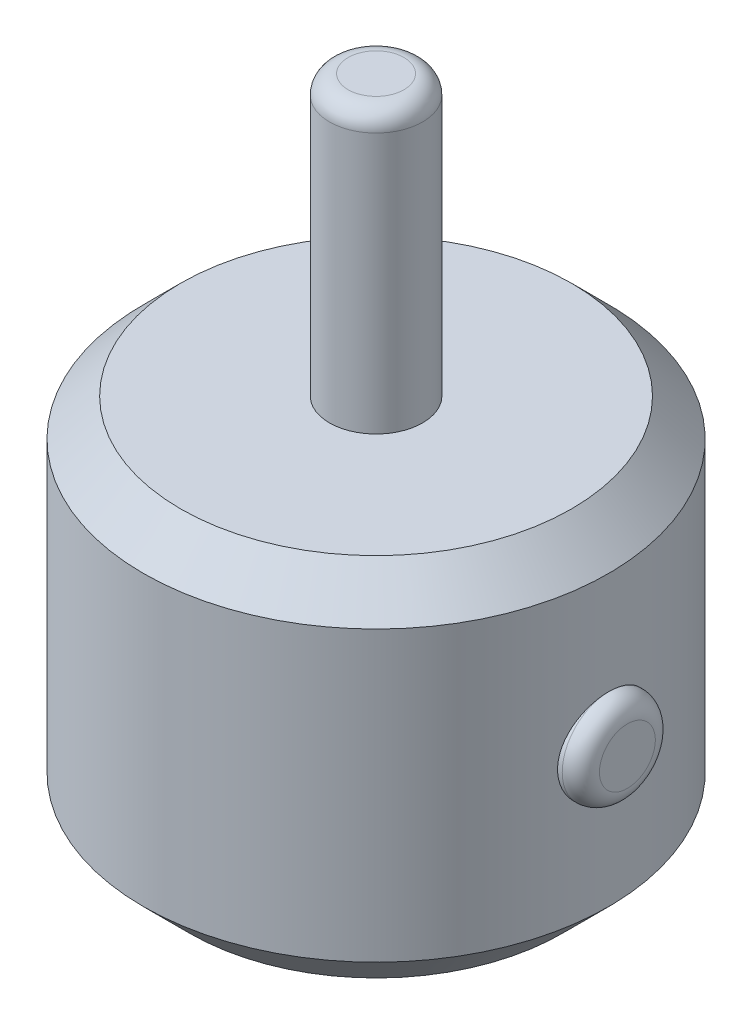
ISO-10303-21;
HEADER;
FILE_DESCRIPTION(('STEP AP214'),'2;1');
FILE_NAME('part.step','',(''),(''),'','','');
FILE_SCHEMA(('AUTOMOTIVE_DESIGN { 1 0 10303 214 1 1 1 1 }'));
ENDSEC;
DATA;
#1=APPLICATION_CONTEXT('core data for automotive mechanical design processes');
#2=APPLICATION_PROTOCOL_DEFINITION('international standard','automotive_design',2000,#1);
#3=PRODUCT_CONTEXT('',#1,'mechanical');
#4=PRODUCT('Part','Part','',(#3));
#5=PRODUCT_RELATED_PRODUCT_CATEGORY('part','',(#4));
#6=PRODUCT_DEFINITION_FORMATION('','',#4);
#7=PRODUCT_DEFINITION_CONTEXT('part definition',#1,'design');
#8=PRODUCT_DEFINITION('design','',#6,#7);
#9=PRODUCT_DEFINITION_SHAPE('','',#8);
#10=(LENGTH_UNIT() NAMED_UNIT(*) SI_UNIT(.MILLI.,.METRE.));
#11=(NAMED_UNIT(*) PLANE_ANGLE_UNIT() SI_UNIT($,.RADIAN.));
#12=(NAMED_UNIT(*) SI_UNIT($,.STERADIAN.) SOLID_ANGLE_UNIT());
#13=UNCERTAINTY_MEASURE_WITH_UNIT(LENGTH_MEASURE(1.E-05),#10,'distance_accuracy_value','');
#14=(GEOMETRIC_REPRESENTATION_CONTEXT(3) GLOBAL_UNCERTAINTY_ASSIGNED_CONTEXT((#13)) GLOBAL_UNIT_ASSIGNED_CONTEXT((#10,
#11,#12)) REPRESENTATION_CONTEXT('',''));
#15=CARTESIAN_POINT('',(0.,0.,0.));
#16=DIRECTION('',(0.,0.,1.));
#17=DIRECTION('',(1.,0.,0.));
#18=AXIS2_PLACEMENT_3D('',#15,#16,#17);
#19=CARTESIAN_POINT('',(27.,20.,0.));
#20=DIRECTION('',(-1.,0.,0.));
#21=DIRECTION('',(0.,0.,1.));
#22=AXIS2_PLACEMENT_3D('',#19,#20,#21);
#23=CYLINDRICAL_SURFACE('',#22,5.);
#24=CARTESIAN_POINT('',(24.4948974278318,20.,5.));
#25=CARTESIAN_POINT('',(24.4948959140652,20.1389562284322,5.00000277932283));
#26=CARTESIAN_POINT('',(24.4960820445244,20.277877759427,4.99420583952395));
#27=CARTESIAN_POINT('',(24.5007881327193,20.5547609107824,4.97106951247274));
#28=CARTESIAN_POINT('',(24.5043085313918,20.692722344807,4.95372794446977));
#29=CARTESIAN_POINT('',(24.5135833999899,20.9667141290813,4.90762442723258));
#30=CARTESIAN_POINT('',(24.5193390123237,21.1027434549275,4.8788566379347));
#31=CARTESIAN_POINT('',(24.5329168521693,21.3718889208066,4.8101161975473));
#32=CARTESIAN_POINT('',(24.5407398404405,21.5050039688689,4.77013942141009));
#33=CARTESIAN_POINT('',(24.5582115919251,21.7671561405252,4.679356239882));
#34=CARTESIAN_POINT('',(24.5678578195523,21.8961986403977,4.62856486213672));
#35=CARTESIAN_POINT('',(24.5887102826167,22.1495630412791,4.51647818958425));
#36=CARTESIAN_POINT('',(24.5999170932378,22.2738831801666,4.45517901998884));
#37=CARTESIAN_POINT('',(24.6235656382957,22.5168633390302,4.32256259117468));
#38=CARTESIAN_POINT('',(24.6360068230559,22.6355258438509,4.25124978528394));
#39=CARTESIAN_POINT('',(24.6617859698465,22.8665078033123,4.09905714012307));
#40=CARTESIAN_POINT('',(24.6751242659164,22.9788248662625,4.01817372862809));
#41=CARTESIAN_POINT('',(24.7024933301151,23.1976726271486,3.84635941756609));
#42=CARTESIAN_POINT('',(24.7165306060046,23.3041149652436,3.7553169869603));
#43=CARTESIAN_POINT('',(24.7447550172108,23.5090176111652,3.56460271884441));
#44=CARTESIAN_POINT('',(24.7589422061409,23.6074749460279,3.46492769556318));
#45=CARTESIAN_POINT('',(24.7870621737417,23.7956696544435,3.25767968751707));
#46=CARTESIAN_POINT('',(24.80099502638,23.885409597144,3.15010904621878));
#47=CARTESIAN_POINT('',(24.8282290266689,24.0556155324462,2.92772937682516));
#48=CARTESIAN_POINT('',(24.8415299396397,24.1360780953441,2.81291769594009));
#49=CARTESIAN_POINT('',(24.867232331661,24.2877599293321,2.57586269555548));
#50=CARTESIAN_POINT('',(24.8796253494226,24.3588961857274,2.45356521066841));
#51=CARTESIAN_POINT('',(24.9030409030999,24.4906156197631,2.20327286170084));
#52=CARTESIAN_POINT('',(24.9140629244939,24.5511948388487,2.0752758829805));
#53=CARTESIAN_POINT('',(24.9445697433125,24.7162935264673,1.68417147036292));
#54=CARTESIAN_POINT('',(24.9615274484324,24.8043568478153,1.4136645417639));
#55=CARTESIAN_POINT('',(24.9865205281948,24.9325572950363,0.865044260538016));
#56=CARTESIAN_POINT('',(24.9946705178815,24.9733105994109,0.587078089251455));
#57=CARTESIAN_POINT('',(25.001544855821,25.0077490481861,0.028103447988119));
#58=CARTESIAN_POINT('',(25.0002701123409,25.0014387281359,-0.252904726222846));
#59=CARTESIAN_POINT('',(24.9885220591615,24.9423705973681,-0.80571278645345));
#60=CARTESIAN_POINT('',(24.9781800029126,24.8902755157609,-1.07758681729646));
#61=CARTESIAN_POINT('',(24.9496087733464,24.7421744360893,-1.60865738706756));
#62=CARTESIAN_POINT('',(24.93137928446,24.6461666811094,-1.86785341829838));
#63=CARTESIAN_POINT('',(24.8888648238832,24.4123499078751,-2.36809751770485));
#64=CARTESIAN_POINT('',(24.8645424148967,24.2742812735962,-2.6090209247494));
#65=CARTESIAN_POINT('',(24.812523467553,23.960454584693,-3.06452517521266));
#66=CARTESIAN_POINT('',(24.7848265411053,23.7846921932812,-3.27910298301493));
#67=CARTESIAN_POINT('',(24.7285482199077,23.396831897461,-3.67975717013202));
#68=CARTESIAN_POINT('',(24.6999598233212,23.1841540684962,-3.86527158685728));
#69=CARTESIAN_POINT('',(24.6455785794926,22.730417785602,-4.19809246189484));
#70=CARTESIAN_POINT('',(24.6197857851305,22.4893587950106,-4.3453981975471));
#71=CARTESIAN_POINT('',(24.5739023737433,21.9848958414656,-4.5978140751034));
#72=CARTESIAN_POINT('',(24.5538240781191,21.7214451619493,-4.7028332392629));
#73=CARTESIAN_POINT('',(24.521823816122,21.1801433812325,-4.86695170776361));
#74=CARTESIAN_POINT('',(24.5099007867518,20.9022941618889,-4.9260569968798));
#75=CARTESIAN_POINT('',(24.4957739630664,20.345175710013,-4.99583003057767));
#76=CARTESIAN_POINT('',(24.493407351626,20.0660121283523,-5.00730929570102));
#77=CARTESIAN_POINT('',(24.4982242831088,19.5097588840755,-4.98368814034094));
#78=CARTESIAN_POINT('',(24.5054072844901,19.2326691047538,-4.94859036116145));
#79=CARTESIAN_POINT('',(24.5283616252697,18.691156798201,-4.83351104478034));
#80=CARTESIAN_POINT('',(24.5440499515026,18.4266382835349,-4.75396312055877));
#81=CARTESIAN_POINT('',(24.5821744668054,17.9146836061427,-4.55270516017896));
#82=CARTESIAN_POINT('',(24.6046112117261,17.6672488526292,-4.43099165081897));
#83=CARTESIAN_POINT('',(24.6540703007231,17.1929344453787,-4.1470207729206));
#84=CARTESIAN_POINT('',(24.6811486029996,16.9663647502071,-3.98425562210339));
#85=CARTESIAN_POINT('',(24.7366861815763,16.5434584582861,-3.62347762885003));
#86=CARTESIAN_POINT('',(24.7651455997886,16.3471249770485,-3.4254611586761));
#87=CARTESIAN_POINT('',(24.8207673304219,15.9871871347289,-2.99616224784609));
#88=CARTESIAN_POINT('',(24.8479030243562,15.8241314661047,-2.76441580370579));
#89=CARTESIAN_POINT('',(24.8973562425148,15.5392708531364,-2.27633617425512));
#90=CARTESIAN_POINT('',(24.9196739690654,15.4174641764542,-2.02000402205358));
#91=CARTESIAN_POINT('',(24.9568652187611,15.2193546736938,-1.49152568807435));
#92=CARTESIAN_POINT('',(24.9717808767,15.1427938073628,-1.21947909079514));
#93=CARTESIAN_POINT('',(24.9926598775445,15.0365473627529,-0.66590155550293));
#94=CARTESIAN_POINT('',(24.9986242986841,15.0068561387025,-0.384371763979328));
#95=CARTESIAN_POINT('',(25.0003623098663,14.9981996109053,0.0359308696076345));
#96=CARTESIAN_POINT('',(24.9997743264358,15.0011243579901,0.174547706902776));
#97=CARTESIAN_POINT('',(24.9963121932555,15.0184614591688,0.451018250343529));
#98=CARTESIAN_POINT('',(24.9934389105404,15.0328694565611,0.588872225946724));
#99=CARTESIAN_POINT('',(24.9854807163608,15.0730713631604,0.862882900616902));
#100=CARTESIAN_POINT('',(24.9803950389143,15.0988692158439,0.999038995028387));
#101=CARTESIAN_POINT('',(24.9681563049873,15.1616348344895,1.2686070645044));
#102=CARTESIAN_POINT('',(24.9610039876105,15.1985986073367,1.40202000237943));
#103=CARTESIAN_POINT('',(24.9448434641995,15.283333842036,1.66496388536662));
#104=CARTESIAN_POINT('',(24.9358388825964,15.3310842147796,1.79450185423182));
#105=CARTESIAN_POINT('',(24.9162142305196,15.4370579226831,2.04903823379663));
#106=CARTESIAN_POINT('',(24.9055947327996,15.4952775461006,2.17403823455953));
#107=CARTESIAN_POINT('',(24.8830203693368,15.621806617004,2.4187611555957));
#108=CARTESIAN_POINT('',(24.8710649550885,15.6901202126488,2.53848187993982));
#109=CARTESIAN_POINT('',(24.8461484673941,15.8363143926543,2.77176194719752));
#110=CARTESIAN_POINT('',(24.8331877403362,15.9141916871162,2.88532338962303));
#111=CARTESIAN_POINT('',(24.8063847462598,16.0803627674977,3.107409439357));
#112=CARTESIAN_POINT('',(24.7925314606031,16.1688072543281,3.21581998719232));
#113=CARTESIAN_POINT('',(24.7645291791264,16.3544114026234,3.42479299282091));
#114=CARTESIAN_POINT('',(24.7503802888953,16.4515679916407,3.52535819417319));
#115=CARTESIAN_POINT('',(24.7221657734697,16.654027473391,3.71806545178664));
#116=CARTESIAN_POINT('',(24.7081002031371,16.7593352036443,3.81020243422067));
#117=CARTESIAN_POINT('',(24.6804587105912,16.9772989618448,3.98532502872243));
#118=CARTESIAN_POINT('',(24.6668826104611,17.0899522770722,4.06831398902585));
#119=CARTESIAN_POINT('',(24.6404498236186,17.3231851569173,4.22547700693866));
#120=CARTESIAN_POINT('',(24.6276028717508,17.4438392291971,4.29954219421514));
#121=CARTESIAN_POINT('',(24.6031736469171,17.6910444688427,4.43719880973621));
#122=CARTESIAN_POINT('',(24.5915909100867,17.8175934487732,4.50079408397347));
#123=CARTESIAN_POINT('',(24.5700331062172,18.0756711155363,4.61703044134767));
#124=CARTESIAN_POINT('',(24.5600570592754,18.207196706272,4.6696782069991));
#125=CARTESIAN_POINT('',(24.5420037041339,18.4743139980983,4.76364722951765));
#126=CARTESIAN_POINT('',(24.5339260286217,18.6099049068635,4.80497067776392));
#127=CARTESIAN_POINT('',(24.516494143671,18.9512176883912,4.89330917087388));
#128=CARTESIAN_POINT('',(24.5084401426211,19.158877951458,4.9332633683589));
#129=CARTESIAN_POINT('',(24.4976430260943,19.5777189171731,4.98660621384694));
#130=CARTESIAN_POINT('',(24.4948997275263,19.7888994982022,4.99999577768878));
#131=CARTESIAN_POINT('',(24.4948974278318,20.,5.));
#132=B_SPLINE_CURVE_WITH_KNOTS('',3,(#24,#25,#26,#27,#28,#29,#30,#31,#32,#33,#34,#35,#36,#37,
#38,#39,#40,#41,#42,#43,#44,#45,#46,#47,#48,#49,#50,#51,#52,#53,#54,#55,#56,#57,#58,#59,#60,#61,
#62,#63,#64,#65,#66,#67,#68,#69,#70,#71,#72,#73,#74,#75,#76,#77,#78,#79,#80,#81,#82,#83,#84,#85,
#86,#87,#88,#89,#90,#91,#92,#93,#94,#95,#96,#97,#98,#99,#100,#101,#102,#103,#104,#105,#106,#107,
#108,#109,#110,#111,#112,#113,#114,#115,#116,#117,#118,#119,#120,#121,#122,#123,#124,#125,#126,
#127,#128,#129,#130,#131),.UNSPECIFIED.,.T.,.F.,(4,2,2,2,2,2,2,2,2,2,2,2,2,2,2,2,2,2,2,2,2,2,2,
2,2,2,2,2,2,2,2,2,2,2,2,2,2,2,2,2,2,2,2,2,2,2,2,2,2,2,2,2,2,4),(0.,0.416683123532559,
0.833444979779735,1.25042012213458,1.66754891843382,2.08410182437339,2.50080866752238,
2.91733077366026,3.33400883985332,3.75582155231457,4.17779059926178,4.59963490581338,
5.02163466502477,5.44716701587087,5.87285858614629,6.72323197660177,7.5624010084278,
8.4014891700862,9.22862804595066,10.0558000179613,10.8881847753889,11.7206653527771,
12.5676559023979,13.4146624704098,14.2634817229126,15.112190315075,15.9463764545252,
16.780515290738,17.6066556534829,18.4328640820369,19.269841553043,20.1069052078274,
20.9568186509895,21.8066963958222,22.6516792432494,23.4965602988983,23.9121012971265,
24.3274847156827,24.7430120641575,25.158390988859,25.5729647204247,25.9873917587991,
26.4019895837877,26.8164451851411,27.2377409358741,27.6588886906077,28.0802883323104,
28.5015332232677,28.9274855291216,29.3532810158644,29.7788158230356,30.2042682263315,
30.8373096537297,31.4703292560956),.UNSPECIFIED.);
#133=CARTESIAN_POINT('',(25.,25.,0.));
#134=VERTEX_POINT('',#133);
#135=CARTESIAN_POINT('',(25.,15.,0.));
#136=VERTEX_POINT('',#135);
#137=EDGE_CURVE('E68',#134,#136,#132,.T.);
#138=ORIENTED_EDGE('',*,*,#137,.F.);
#139=CARTESIAN_POINT('',(25.,20.,0.));
#140=DIRECTION('',(-1.,0.,0.));
#141=DIRECTION('',(0.,0.,1.));
#142=AXIS2_PLACEMENT_3D('',#139,#140,#141);
#143=CIRCLE('',#142,5.);
#144=EDGE_CURVE('E61',#134,#136,#143,.T.);
#145=ORIENTED_EDGE('',*,*,#144,.T.);
#146=EDGE_LOOP('',(#138,#145));
#147=FACE_BOUND('',#146,.T.);
#148=ADVANCED_FACE('F38',(#147),#23,.T.);
#149=CARTESIAN_POINT('',(0.,40.,0.));
#150=DIRECTION('',(0.,-1.,0.));
#151=DIRECTION('',(0.,0.,-1.));
#152=AXIS2_PLACEMENT_3D('',#149,#150,#151);
#153=CYLINDRICAL_SURFACE('',#152,25.);
#154=CARTESIAN_POINT('',(0.,4.99999999999998,0.));
#155=DIRECTION('',(0.,1.,0.));
#156=DIRECTION('',(0.,0.,1.));
#157=AXIS2_PLACEMENT_3D('',#154,#155,#156);
#158=CIRCLE('',#157,25.);
#159=CARTESIAN_POINT('',(0.,4.99999999999998,25.));
#160=VERTEX_POINT('',#159);
#161=EDGE_CURVE('E47',#160,#160,#158,.T.);
#162=ORIENTED_EDGE('',*,*,#161,.T.);
#163=EDGE_LOOP('',(#162));
#164=FACE_BOUND('',#163,.T.);
#165=ORIENTED_EDGE('',*,*,#137,.T.);
#166=EDGE_CURVE('E59',#136,#134,#132,.T.);
#167=ORIENTED_EDGE('',*,*,#166,.T.);
#168=EDGE_LOOP('',(#165,#167));
#169=FACE_BOUND('',#168,.T.);
#170=CARTESIAN_POINT('',(0.,36.,0.));
#171=DIRECTION('',(0.,1.,0.));
#172=DIRECTION('',(0.,0.,1.));
#173=AXIS2_PLACEMENT_3D('',#170,#171,#172);
#174=CIRCLE('',#173,25.);
#175=CARTESIAN_POINT('',(0.,36.,25.));
#176=VERTEX_POINT('',#175);
#177=EDGE_CURVE('E62',#176,#176,#174,.F.);
#178=ORIENTED_EDGE('',*,*,#177,.T.);
#179=EDGE_LOOP('',(#178));
#180=FACE_BOUND('',#179,.T.);
#181=ADVANCED_FACE('F66',(#164,#169,#180),#153,.T.);
#182=CARTESIAN_POINT('',(0.,40.,0.));
#183=DIRECTION('',(0.,1.,0.));
#184=DIRECTION('',(0.,0.,1.));
#185=AXIS2_PLACEMENT_3D('',#182,#183,#184);
#186=PLANE('',#185);
#187=CARTESIAN_POINT('',(0.,40.,0.));
#188=DIRECTION('',(0.,1.,0.));
#189=DIRECTION('',(0.,0.,1.));
#190=AXIS2_PLACEMENT_3D('',#187,#188,#189);
#191=CIRCLE('',#190,21.);
#192=CARTESIAN_POINT('',(0.,40.,21.));
#193=VERTEX_POINT('',#192);
#194=EDGE_CURVE('E130',#193,#193,#191,.T.);
#195=ORIENTED_EDGE('',*,*,#194,.T.);
#196=EDGE_LOOP('',(#195));
#197=FACE_BOUND('',#196,.T.);
#198=CARTESIAN_POINT('',(0.,40.,0.));
#199=DIRECTION('',(0.,1.,0.));
#200=DIRECTION('',(0.,0.,1.));
#201=AXIS2_PLACEMENT_3D('',#198,#199,#200);
#202=CIRCLE('',#201,5.);
#203=CARTESIAN_POINT('',(0.,40.,5.));
#204=VERTEX_POINT('',#203);
#205=EDGE_CURVE('E71',#204,#204,#202,.T.);
#206=ORIENTED_EDGE('',*,*,#205,.F.);
#207=EDGE_LOOP('',(#206));
#208=FACE_BOUND('',#207,.T.);
#209=ADVANCED_FACE('F94',(#197,#208),#186,.T.);
#210=CARTESIAN_POINT('',(0.,0.,0.));
#211=DIRECTION('',(0.,1.,0.));
#212=DIRECTION('',(0.,0.,1.));
#213=AXIS2_PLACEMENT_3D('',#210,#211,#212);
#214=PLANE('',#213);
#215=CARTESIAN_POINT('',(0.,0.,0.));
#216=DIRECTION('',(0.,1.,0.));
#217=DIRECTION('',(0.,0.,1.));
#218=AXIS2_PLACEMENT_3D('',#215,#216,#217);
#219=CIRCLE('',#218,20.);
#220=CARTESIAN_POINT('',(0.,0.,20.));
#221=VERTEX_POINT('',#220);
#222=EDGE_CURVE('E11',#221,#221,#219,.F.);
#223=ORIENTED_EDGE('',*,*,#222,.T.);
#224=EDGE_LOOP('',(#223));
#225=FACE_BOUND('',#224,.T.);
#226=ADVANCED_FACE('F122',(#225),#214,.F.);
#227=CARTESIAN_POINT('',(0.,70.,0.));
#228=DIRECTION('',(0.,-1.,0.));
#229=DIRECTION('',(0.,0.,-1.));
#230=AXIS2_PLACEMENT_3D('',#227,#228,#229);
#231=CYLINDRICAL_SURFACE('',#230,5.);
#232=CARTESIAN_POINT('',(0.,68.,0.));
#233=DIRECTION('',(0.,1.,0.));
#234=DIRECTION('',(0.,0.,1.));
#235=AXIS2_PLACEMENT_3D('',#232,#233,#234);
#236=CIRCLE('',#235,5.);
#237=CARTESIAN_POINT('',(0.,68.,5.));
#238=VERTEX_POINT('',#237);
#239=EDGE_CURVE('E133',#238,#238,#236,.F.);
#240=ORIENTED_EDGE('',*,*,#239,.T.);
#241=EDGE_LOOP('',(#240));
#242=FACE_BOUND('',#241,.T.);
#243=ORIENTED_EDGE('',*,*,#205,.T.);
#244=EDGE_LOOP('',(#243));
#245=FACE_BOUND('',#244,.T.);
#246=ADVANCED_FACE('F142',(#242,#245),#231,.T.);
#247=CARTESIAN_POINT('',(0.,70.,0.));
#248=DIRECTION('',(0.,1.,0.));
#249=DIRECTION('',(0.,0.,1.));
#250=AXIS2_PLACEMENT_3D('',#247,#248,#249);
#251=PLANE('',#250);
#252=CARTESIAN_POINT('',(0.,70.,0.));
#253=DIRECTION('',(0.,1.,0.));
#254=DIRECTION('',(0.,0.,1.));
#255=AXIS2_PLACEMENT_3D('',#252,#253,#254);
#256=CIRCLE('',#255,3.);
#257=CARTESIAN_POINT('',(0.,70.,3.));
#258=VERTEX_POINT('',#257);
#259=EDGE_CURVE('E136',#258,#258,#256,.T.);
#260=ORIENTED_EDGE('',*,*,#259,.T.);
#261=EDGE_LOOP('',(#260));
#262=FACE_BOUND('',#261,.T.);
#263=ADVANCED_FACE('F112',(#262),#251,.T.);
#264=CARTESIAN_POINT('',(0.,68.,0.));
#265=DIRECTION('',(0.,1.,0.));
#266=DIRECTION('',(0.,0.,1.));
#267=AXIS2_PLACEMENT_3D('',#264,#265,#266);
#268=TOROIDAL_SURFACE('',#267,3.,2.);
#269=ORIENTED_EDGE('',*,*,#239,.F.);
#270=EDGE_LOOP('',(#269));
#271=FACE_BOUND('',#270,.T.);
#272=ORIENTED_EDGE('',*,*,#259,.F.);
#273=EDGE_LOOP('',(#272));
#274=FACE_BOUND('',#273,.T.);
#275=ADVANCED_FACE('F106',(#271,#274),#268,.T.);
#276=CARTESIAN_POINT('',(0.,40.,0.));
#277=DIRECTION('',(0.,-1.,0.));
#278=DIRECTION('',(0.,0.,-1.));
#279=AXIS2_PLACEMENT_3D('',#276,#277,#278);
#280=CONICAL_SURFACE('',#279,21.,0.785398163397444);
#281=ORIENTED_EDGE('',*,*,#177,.F.);
#282=EDGE_LOOP('',(#281));
#283=FACE_BOUND('',#282,.T.);
#284=ORIENTED_EDGE('',*,*,#194,.F.);
#285=EDGE_LOOP('',(#284));
#286=FACE_BOUND('',#285,.T.);
#287=ADVANCED_FACE('F100',(#283,#286),#280,.T.);
#288=ORIENTED_EDGE('',*,*,#166,.F.);
#289=CARTESIAN_POINT('',(25.,20.,0.));
#290=DIRECTION('',(-1.,0.,0.));
#291=DIRECTION('',(0.,0.,1.));
#292=AXIS2_PLACEMENT_3D('',#289,#290,#291);
#293=CIRCLE('',#292,5.);
#294=EDGE_CURVE('E53',#136,#134,#293,.T.);
#295=ORIENTED_EDGE('',*,*,#294,.T.);
#296=EDGE_LOOP('',(#288,#295));
#297=FACE_BOUND('',#296,.T.);
#298=ADVANCED_FACE('F58',(#297),#23,.T.);
#299=CARTESIAN_POINT('',(27.,20.,0.));
#300=DIRECTION('',(-1.,0.,0.));
#301=DIRECTION('',(0.,0.,1.));
#302=AXIS2_PLACEMENT_3D('',#299,#300,#301);
#303=PLANE('',#302);
#304=CARTESIAN_POINT('',(27.,20.,0.));
#305=DIRECTION('',(-1.,0.,0.));
#306=DIRECTION('',(0.,0.,1.));
#307=AXIS2_PLACEMENT_3D('',#304,#305,#306);
#308=CIRCLE('',#307,3.);
#309=CARTESIAN_POINT('',(27.,20.,3.));
#310=VERTEX_POINT('',#309);
#311=EDGE_CURVE('E73',#310,#310,#308,.F.);
#312=ORIENTED_EDGE('',*,*,#311,.T.);
#313=EDGE_LOOP('',(#312));
#314=FACE_BOUND('',#313,.T.);
#315=ADVANCED_FACE('F86',(#314),#303,.F.);
#316=CARTESIAN_POINT('',(25.,20.,0.));
#317=DIRECTION('',(-1.,0.,0.));
#318=DIRECTION('',(0.,0.,1.));
#319=AXIS2_PLACEMENT_3D('',#316,#317,#318);
#320=TOROIDAL_SURFACE('',#319,3.,2.);
#321=ORIENTED_EDGE('',*,*,#311,.F.);
#322=EDGE_LOOP('',(#321));
#323=FACE_BOUND('',#322,.T.);
#324=ORIENTED_EDGE('',*,*,#294,.F.);
#325=ORIENTED_EDGE('',*,*,#144,.F.);
#326=EDGE_LOOP('',(#324,#325));
#327=FACE_BOUND('',#326,.T.);
#328=ADVANCED_FACE('F72',(#323,#327),#320,.T.);
#329=CARTESIAN_POINT('',(0.,4.99999999999998,0.));
#330=DIRECTION('',(0.,1.,0.));
#331=DIRECTION('',(0.,0.,1.));
#332=AXIS2_PLACEMENT_3D('',#329,#330,#331);
#333=CONICAL_SURFACE('',#332,25.,0.78539816339745);
#334=ORIENTED_EDGE('',*,*,#222,.F.);
#335=EDGE_LOOP('',(#334));
#336=FACE_BOUND('',#335,.T.);
#337=ORIENTED_EDGE('',*,*,#161,.F.);
#338=EDGE_LOOP('',(#337));
#339=FACE_BOUND('',#338,.T.);
#340=ADVANCED_FACE('F41',(#336,#339),#333,.T.);
#341=CLOSED_SHELL('',(#148,#181,#209,#226,#246,#263,#275,#287,#298,#315,#328,#340));
#342=MANIFOLD_SOLID_BREP('B2',#341);
#343=ADVANCED_BREP_SHAPE_REPRESENTATION('',(#18,#342),#14);
#344=SHAPE_DEFINITION_REPRESENTATION(#9,#343);
ENDSEC;
END-ISO-10303-21;
